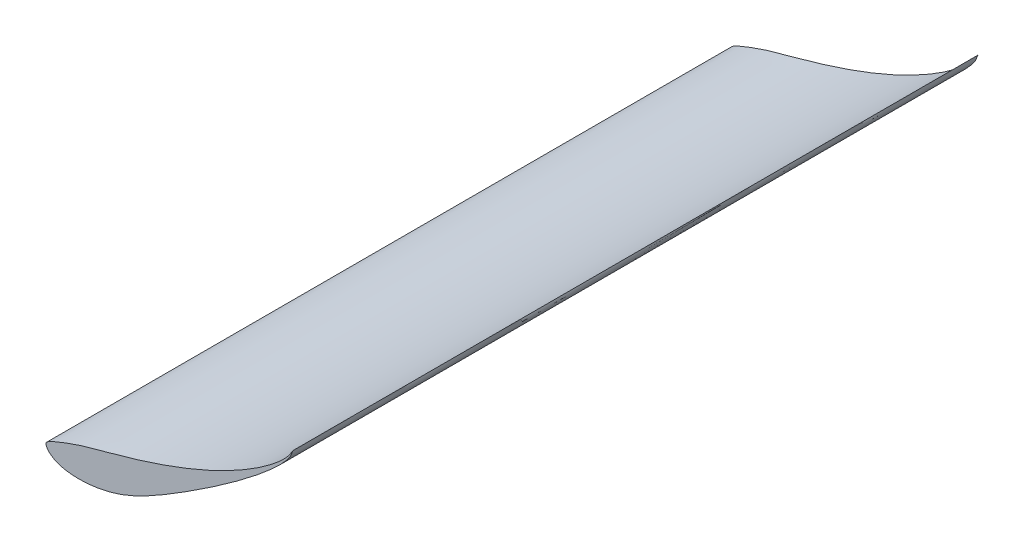
ISO-10303-21;
HEADER;
FILE_DESCRIPTION(('STEP AP214'),'2;1');
FILE_NAME('part.step','',(''),(''),'','','');
FILE_SCHEMA(('AUTOMOTIVE_DESIGN { 1 0 10303 214 1 1 1 1 }'));
ENDSEC;
DATA;
#1=APPLICATION_CONTEXT('core data for automotive mechanical design processes');
#2=APPLICATION_PROTOCOL_DEFINITION('international standard','automotive_design',2000,#1);
#3=PRODUCT_CONTEXT('',#1,'mechanical');
#4=PRODUCT('Part','Part','',(#3));
#5=PRODUCT_RELATED_PRODUCT_CATEGORY('part','',(#4));
#6=PRODUCT_DEFINITION_FORMATION('','',#4);
#7=PRODUCT_DEFINITION_CONTEXT('part definition',#1,'design');
#8=PRODUCT_DEFINITION('design','',#6,#7);
#9=PRODUCT_DEFINITION_SHAPE('','',#8);
#10=(LENGTH_UNIT() NAMED_UNIT(*) SI_UNIT(.MILLI.,.METRE.));
#11=(NAMED_UNIT(*) PLANE_ANGLE_UNIT() SI_UNIT($,.RADIAN.));
#12=(NAMED_UNIT(*) SI_UNIT($,.STERADIAN.) SOLID_ANGLE_UNIT());
#13=UNCERTAINTY_MEASURE_WITH_UNIT(LENGTH_MEASURE(1.E-05),#10,'distance_accuracy_value','');
#14=(GEOMETRIC_REPRESENTATION_CONTEXT(3) GLOBAL_UNCERTAINTY_ASSIGNED_CONTEXT((#13)) GLOBAL_UNIT_ASSIGNED_CONTEXT((#10,
#11,#12)) REPRESENTATION_CONTEXT('',''));
#15=CARTESIAN_POINT('',(0.,0.,0.));
#16=DIRECTION('',(0.,0.,1.));
#17=DIRECTION('',(1.,0.,0.));
#18=AXIS2_PLACEMENT_3D('',#15,#16,#17);
#19=CARTESIAN_POINT('',(161.78292833385,78.9068064220341,225.));
#20=CARTESIAN_POINT('',(161.779890528459,78.9105267032101,225.));
#21=CARTESIAN_POINT('',(161.361767914941,78.181322040841,225.));
#22=CARTESIAN_POINT('',(160.872984322097,77.4239718536298,225.));
#23=CARTESIAN_POINT('',(159.596742998734,75.4604825054433,225.));
#24=CARTESIAN_POINT('',(157.720496903785,73.0950450264297,225.));
#25=CARTESIAN_POINT('',(154.914276771153,70.1415204381813,225.));
#26=CARTESIAN_POINT('',(151.307423479854,66.8974160847578,225.));
#27=CARTESIAN_POINT('',(146.950282394384,63.3845742926751,225.));
#28=CARTESIAN_POINT('',(141.906063930267,59.7027741862972,225.));
#29=CARTESIAN_POINT('',(136.223432896034,55.9166630844412,225.));
#30=CARTESIAN_POINT('',(129.969981168829,52.088644910438,225.));
#31=CARTESIAN_POINT('',(123.212042913218,48.2809366699587,225.));
#32=CARTESIAN_POINT('',(116.03070441763,44.5396883417728,225.));
#33=CARTESIAN_POINT('',(108.507071587861,40.9100453595632,225.));
#34=CARTESIAN_POINT('',(100.725974603383,37.4306726469589,225.));
#35=CARTESIAN_POINT('',(92.777279952241,34.1281303923126,225.));
#36=CARTESIAN_POINT('',(84.7506190074985,31.0234144511162,225.));
#37=CARTESIAN_POINT('',(76.7316485418162,28.1372099946649,225.));
#38=CARTESIAN_POINT('',(68.810432320772,25.4674325084842,225.));
#39=CARTESIAN_POINT('',(61.0676685014536,23.0186846786382,225.));
#40=CARTESIAN_POINT('',(53.5847650426942,20.7819688270092,225.));
#41=CARTESIAN_POINT('',(46.4340457349053,18.7453778583554,225.));
#42=CARTESIAN_POINT('',(39.6852829855735,16.8884859248006,225.));
#43=CARTESIAN_POINT('',(33.4007785153507,15.1821298053462,225.));
#44=CARTESIAN_POINT('',(27.6221760284338,13.6122493136479,225.));
#45=CARTESIAN_POINT('',(22.3792349666251,12.0507487268589,225.));
#46=CARTESIAN_POINT('',(17.6603141897234,10.4615541187885,225.));
#47=CARTESIAN_POINT('',(13.4177767791754,8.9478404004681,225.));
#48=CARTESIAN_POINT('',(9.66654653539217,7.52880663894562,225.));
#49=CARTESIAN_POINT('',(6.44701805109813,6.21485419211678,225.));
#50=CARTESIAN_POINT('',(3.77915860551049,5.0531293587535,225.));
#51=CARTESIAN_POINT('',(1.73706036374504,3.9666714024391,225.));
#52=CARTESIAN_POINT('',(0.255014697455236,3.15049500516819,225.));
#53=CARTESIAN_POINT('',(-0.612510818545581,2.06211065328241,225.));
#54=CARTESIAN_POINT('',(-0.388381138025455,0.831268733081405,225.));
#55=CARTESIAN_POINT('',(0.135766851155978,-0.374288757361763,225.));
#56=CARTESIAN_POINT('',(1.08366074359763,-1.63964265183041,225.));
#57=CARTESIAN_POINT('',(2.3818775815346,-2.87826194582571,225.));
#58=CARTESIAN_POINT('',(4.03353861722545,-4.0441468062405,225.));
#59=CARTESIAN_POINT('',(6.01638103204055,-5.10348739841658,225.));
#60=CARTESIAN_POINT('',(8.35379285350588,-5.98236364560135,225.));
#61=CARTESIAN_POINT('',(11.0315489398007,-6.67022982496091,225.));
#62=CARTESIAN_POINT('',(14.0307852544234,-7.19805140512737,225.));
#63=CARTESIAN_POINT('',(17.3339631976692,-7.53218836319167,225.));
#64=CARTESIAN_POINT('',(20.914788835034,-7.65910589997498,225.));
#65=CARTESIAN_POINT('',(24.7494029994471,-7.56913669899957,225.));
#66=CARTESIAN_POINT('',(28.8135163870402,-7.23798229280122,225.));
#67=CARTESIAN_POINT('',(33.082431282419,-6.66884286338505,225.));
#68=CARTESIAN_POINT('',(37.5265875268402,-5.84075548538762,225.));
#69=CARTESIAN_POINT('',(42.1200669350474,-4.74263719445097,225.));
#70=CARTESIAN_POINT('',(46.8336557360594,-3.32539469082277,225.));
#71=CARTESIAN_POINT('',(51.669344781116,-1.59043528701546,225.));
#72=CARTESIAN_POINT('',(56.6230897618014,0.517955957713847,225.));
#73=CARTESIAN_POINT('',(61.7065220274405,2.98068239737995,225.));
#74=CARTESIAN_POINT('',(66.9567538070168,5.6976166039557,225.));
#75=CARTESIAN_POINT('',(72.3336969747133,8.68188758465662,225.));
#76=CARTESIAN_POINT('',(77.8229500615314,11.8850880933456,225.));
#77=CARTESIAN_POINT('',(83.4030473685376,15.2686408602552,225.));
#78=CARTESIAN_POINT('',(89.0475887751343,18.7824111048689,225.));
#79=CARTESIAN_POINT('',(94.7137570741183,22.3912773013876,225.));
#80=CARTESIAN_POINT('',(100.360291373089,26.0537862860099,225.));
#81=CARTESIAN_POINT('',(105.936655775352,29.751722799767,225.));
#82=CARTESIAN_POINT('',(111.400902448449,33.4614974533303,225.));
#83=CARTESIAN_POINT('',(116.718635970264,37.158055882973,225.));
#84=CARTESIAN_POINT('',(121.851807554897,40.8249941356383,225.));
#85=CARTESIAN_POINT('',(126.774094995133,44.4344939905141,225.));
#86=CARTESIAN_POINT('',(131.452183110523,47.9685796053568,225.));
#87=CARTESIAN_POINT('',(135.861918866711,51.4000588728441,225.));
#88=CARTESIAN_POINT('',(139.975887074324,54.7089766967872,225.));
#89=CARTESIAN_POINT('',(143.769714100562,57.8753104713641,225.));
#90=CARTESIAN_POINT('',(147.222429639158,60.879306118381,225.));
#91=CARTESIAN_POINT('',(150.316872974653,63.7004737337815,225.));
#92=CARTESIAN_POINT('',(153.035247672918,66.3239759565144,225.));
#93=CARTESIAN_POINT('',(155.365226619223,68.7325336492973,225.));
#94=CARTESIAN_POINT('',(157.297142206756,70.9124448027032,225.));
#95=CARTESIAN_POINT('',(158.834096281736,72.8479891169619,225.));
#96=CARTESIAN_POINT('',(159.963686697046,74.6226458357538,225.));
#97=CARTESIAN_POINT('',(160.663662421299,76.1779194277285,225.));
#98=CARTESIAN_POINT('',(161.212790738735,77.5868099958104,225.));
#99=CARTESIAN_POINT('',(161.447333120915,78.2475076260516,225.));
#100=CARTESIAN_POINT('',(161.785905611456,78.9031602668631,225.));
#101=CARTESIAN_POINT('',(161.78292833385,78.9068064220341,225.));
#102=B_SPLINE_CURVE_WITH_KNOTS('',3,(#19,#20,#21,#22,#23,#24,#25,#26,#27,#28,#29,#30,#31,#32,
#33,#34,#35,#36,#37,#38,#39,#40,#41,#42,#43,#44,#45,#46,#47,#48,#49,#50,#51,#52,#53,#54,#55,#56,
#57,#58,#59,#60,#61,#62,#63,#64,#65,#66,#67,#68,#69,#70,#71,#72,#73,#74,#75,#76,#77,#78,#79,#80,
#81,#82,#83,#84,#85,#86,#87,#88,#89,#90,#91,#92,#93,#94,#95,#96,#97,#98,#99,#100,#101),
.UNSPECIFIED.,.T.,.F.,(4,1,1,1,1,1,1,1,1,1,1,1,1,1,1,1,1,1,1,1,1,1,1,1,1,1,1,1,1,1,1,1,1,1,1,1,
1,1,1,1,1,1,1,1,1,1,1,1,1,1,1,1,1,1,1,1,1,1,1,1,1,1,1,1,1,1,1,1,1,1,1,1,1,1,1,1,1,1,1,1,4),(0.,
0.000999594313299212,0.00414743475003776,0.00974820897402406,0.0180443769200241,
0.0288641783652488,0.0418307896412055,0.056713806957678,0.0733412324180672,0.0915079886594423,
0.111021837040934,0.131661709492213,0.153207715119588,0.175433402170293,0.198110317315045,
0.221011446315139,0.243905882495844,0.266573311035611,0.288810349135398,0.310405035997316,
0.331177743204304,0.350943876391455,0.369556399670184,0.386864963345299,0.402753039208368,
0.417195875784384,0.430379518903367,0.44236263317429,0.453032155511854,0.462284345612073,
0.470026206002306,0.476176644820514,0.4806499474091,0.483553073373249,0.486420689318958,
0.489953231463337,0.49409692674396,0.498850588304448,0.504196750280793,0.510125492183598,
0.516691031253851,0.524011699263473,0.532092122465354,0.540897920896839,0.550403413935838,
0.560581040891741,0.571396483088815,0.582828080950064,0.594829641292505,0.607347037120814,
0.620384325080165,0.633968936607918,0.648199967415963,0.663193936825189,0.678898580785939,
0.695226562400326,0.712113220733955,0.729459406270428,0.747143116877991,0.765009771536014,
0.782904928287736,0.800688045055655,0.818242104849469,0.835449083117584,0.852211620697039,
0.868429578359411,0.884009362888173,0.898854951230209,0.912881826809319,0.926010749515415,
0.938166770937821,0.949289699209522,0.959322171916738,0.968216949447241,0.975948220006129,
0.982474409223121,0.987904722814407,0.992516501480522,0.996351137832237,0.999020322442866,1.),.UNSPECIFIED.);
#103=DIRECTION('',(0.,0.,-1.));
#104=VECTOR('',#103,1.);
#105=SURFACE_OF_LINEAR_EXTRUSION('',#102,#104);
#106=CARTESIAN_POINT('',(161.78292833385,78.9068064220341,225.));
#107=VERTEX_POINT('',#106);
#108=EDGE_CURVE('E10',#107,#107,#102,.T.);
#109=ORIENTED_EDGE('',*,*,#108,.F.);
#110=EDGE_LOOP('',(#109));
#111=FACE_BOUND('',#110,.T.);
#112=CARTESIAN_POINT('',(161.78292833385,78.9068064220341,-225.));
#113=CARTESIAN_POINT('',(161.779890528459,78.9105267032101,-225.));
#114=CARTESIAN_POINT('',(161.361767914941,78.181322040841,-225.));
#115=CARTESIAN_POINT('',(160.872984322097,77.4239718536298,-225.));
#116=CARTESIAN_POINT('',(159.596742998734,75.4604825054433,-225.));
#117=CARTESIAN_POINT('',(157.720496903785,73.0950450264297,-225.));
#118=CARTESIAN_POINT('',(154.914276771153,70.1415204381813,-225.));
#119=CARTESIAN_POINT('',(151.307423479854,66.8974160847578,-225.));
#120=CARTESIAN_POINT('',(146.950282394384,63.3845742926751,-225.));
#121=CARTESIAN_POINT('',(141.906063930267,59.7027741862972,-225.));
#122=CARTESIAN_POINT('',(136.223432896034,55.9166630844412,-225.));
#123=CARTESIAN_POINT('',(129.969981168829,52.088644910438,-225.));
#124=CARTESIAN_POINT('',(123.212042913218,48.2809366699587,-225.));
#125=CARTESIAN_POINT('',(116.03070441763,44.5396883417728,-225.));
#126=CARTESIAN_POINT('',(108.507071587861,40.9100453595632,-225.));
#127=CARTESIAN_POINT('',(100.725974603383,37.4306726469589,-225.));
#128=CARTESIAN_POINT('',(92.777279952241,34.1281303923126,-225.));
#129=CARTESIAN_POINT('',(84.7506190074985,31.0234144511162,-225.));
#130=CARTESIAN_POINT('',(76.7316485418162,28.1372099946649,-225.));
#131=CARTESIAN_POINT('',(68.810432320772,25.4674325084842,-225.));
#132=CARTESIAN_POINT('',(61.0676685014536,23.0186846786382,-225.));
#133=CARTESIAN_POINT('',(53.5847650426942,20.7819688270092,-225.));
#134=CARTESIAN_POINT('',(46.4340457349053,18.7453778583554,-225.));
#135=CARTESIAN_POINT('',(39.6852829855735,16.8884859248006,-225.));
#136=CARTESIAN_POINT('',(33.4007785153507,15.1821298053462,-225.));
#137=CARTESIAN_POINT('',(27.6221760284338,13.6122493136479,-225.));
#138=CARTESIAN_POINT('',(22.3792349666251,12.0507487268589,-225.));
#139=CARTESIAN_POINT('',(17.6603141897234,10.4615541187885,-225.));
#140=CARTESIAN_POINT('',(13.4177767791754,8.9478404004681,-225.));
#141=CARTESIAN_POINT('',(9.66654653539217,7.52880663894562,-225.));
#142=CARTESIAN_POINT('',(6.44701805109813,6.21485419211678,-225.));
#143=CARTESIAN_POINT('',(3.77915860551049,5.0531293587535,-225.));
#144=CARTESIAN_POINT('',(1.73706036374504,3.9666714024391,-225.));
#145=CARTESIAN_POINT('',(0.255014697455236,3.15049500516819,-225.));
#146=CARTESIAN_POINT('',(-0.612510818545581,2.06211065328241,-225.));
#147=CARTESIAN_POINT('',(-0.388381138025455,0.831268733081405,-225.));
#148=CARTESIAN_POINT('',(0.135766851155978,-0.374288757361763,-225.));
#149=CARTESIAN_POINT('',(1.08366074359763,-1.63964265183041,-225.));
#150=CARTESIAN_POINT('',(2.3818775815346,-2.87826194582571,-225.));
#151=CARTESIAN_POINT('',(4.03353861722545,-4.0441468062405,-225.));
#152=CARTESIAN_POINT('',(6.01638103204055,-5.10348739841658,-225.));
#153=CARTESIAN_POINT('',(8.35379285350588,-5.98236364560135,-225.));
#154=CARTESIAN_POINT('',(11.0315489398007,-6.67022982496091,-225.));
#155=CARTESIAN_POINT('',(14.0307852544234,-7.19805140512737,-225.));
#156=CARTESIAN_POINT('',(17.3339631976692,-7.53218836319167,-225.));
#157=CARTESIAN_POINT('',(20.914788835034,-7.65910589997498,-225.));
#158=CARTESIAN_POINT('',(24.7494029994471,-7.56913669899957,-225.));
#159=CARTESIAN_POINT('',(28.8135163870402,-7.23798229280122,-225.));
#160=CARTESIAN_POINT('',(33.082431282419,-6.66884286338505,-225.));
#161=CARTESIAN_POINT('',(37.5265875268402,-5.84075548538762,-225.));
#162=CARTESIAN_POINT('',(42.1200669350474,-4.74263719445097,-225.));
#163=CARTESIAN_POINT('',(46.8336557360594,-3.32539469082277,-225.));
#164=CARTESIAN_POINT('',(51.669344781116,-1.59043528701546,-225.));
#165=CARTESIAN_POINT('',(56.6230897618014,0.517955957713847,-225.));
#166=CARTESIAN_POINT('',(61.7065220274405,2.98068239737995,-225.));
#167=CARTESIAN_POINT('',(66.9567538070168,5.6976166039557,-225.));
#168=CARTESIAN_POINT('',(72.3336969747133,8.68188758465662,-225.));
#169=CARTESIAN_POINT('',(77.8229500615314,11.8850880933456,-225.));
#170=CARTESIAN_POINT('',(83.4030473685376,15.2686408602552,-225.));
#171=CARTESIAN_POINT('',(89.0475887751343,18.7824111048689,-225.));
#172=CARTESIAN_POINT('',(94.7137570741183,22.3912773013876,-225.));
#173=CARTESIAN_POINT('',(100.360291373089,26.0537862860099,-225.));
#174=CARTESIAN_POINT('',(105.936655775352,29.751722799767,-225.));
#175=CARTESIAN_POINT('',(111.400902448449,33.4614974533303,-225.));
#176=CARTESIAN_POINT('',(116.718635970264,37.158055882973,-225.));
#177=CARTESIAN_POINT('',(121.851807554897,40.8249941356383,-225.));
#178=CARTESIAN_POINT('',(126.774094995133,44.4344939905141,-225.));
#179=CARTESIAN_POINT('',(131.452183110523,47.9685796053568,-225.));
#180=CARTESIAN_POINT('',(135.861918866711,51.4000588728441,-225.));
#181=CARTESIAN_POINT('',(139.975887074324,54.7089766967872,-225.));
#182=CARTESIAN_POINT('',(143.769714100562,57.8753104713641,-225.));
#183=CARTESIAN_POINT('',(147.222429639158,60.879306118381,-225.));
#184=CARTESIAN_POINT('',(150.316872974653,63.7004737337815,-225.));
#185=CARTESIAN_POINT('',(153.035247672918,66.3239759565144,-225.));
#186=CARTESIAN_POINT('',(155.365226619223,68.7325336492973,-225.));
#187=CARTESIAN_POINT('',(157.297142206756,70.9124448027032,-225.));
#188=CARTESIAN_POINT('',(158.834096281736,72.8479891169619,-225.));
#189=CARTESIAN_POINT('',(159.963686697046,74.6226458357538,-225.));
#190=CARTESIAN_POINT('',(160.663662421299,76.1779194277285,-225.));
#191=CARTESIAN_POINT('',(161.212790738735,77.5868099958104,-225.));
#192=CARTESIAN_POINT('',(161.447333120915,78.2475076260516,-225.));
#193=CARTESIAN_POINT('',(161.785905611456,78.9031602668631,-225.));
#194=CARTESIAN_POINT('',(161.78292833385,78.9068064220341,-225.));
#195=B_SPLINE_CURVE_WITH_KNOTS('',3,(#112,#113,#114,#115,#116,#117,#118,#119,#120,#121,#122,
#123,#124,#125,#126,#127,#128,#129,#130,#131,#132,#133,#134,#135,#136,#137,#138,#139,#140,#141,
#142,#143,#144,#145,#146,#147,#148,#149,#150,#151,#152,#153,#154,#155,#156,#157,#158,#159,#160,
#161,#162,#163,#164,#165,#166,#167,#168,#169,#170,#171,#172,#173,#174,#175,#176,#177,#178,#179,
#180,#181,#182,#183,#184,#185,#186,#187,#188,#189,#190,#191,#192,#193,#194),.UNSPECIFIED.,.T.,
.F.,(4,1,1,1,1,1,1,1,1,1,1,1,1,1,1,1,1,1,1,1,1,1,1,1,1,1,1,1,1,1,1,1,1,1,1,1,1,1,1,1,1,1,1,1,1,
1,1,1,1,1,1,1,1,1,1,1,1,1,1,1,1,1,1,1,1,1,1,1,1,1,1,1,1,1,1,1,1,1,1,1,4),(0.,
0.000999594313299212,0.00414743475003776,0.00974820897402406,0.0180443769200241,
0.0288641783652488,0.0418307896412055,0.056713806957678,0.0733412324180672,0.0915079886594423,
0.111021837040934,0.131661709492213,0.153207715119588,0.175433402170293,0.198110317315045,
0.221011446315139,0.243905882495844,0.266573311035611,0.288810349135398,0.310405035997316,
0.331177743204304,0.350943876391455,0.369556399670184,0.386864963345299,0.402753039208368,
0.417195875784384,0.430379518903367,0.44236263317429,0.453032155511854,0.462284345612073,
0.470026206002306,0.476176644820514,0.4806499474091,0.483553073373249,0.486420689318958,
0.489953231463337,0.49409692674396,0.498850588304448,0.504196750280793,0.510125492183598,
0.516691031253851,0.524011699263473,0.532092122465354,0.540897920896839,0.550403413935838,
0.560581040891741,0.571396483088815,0.582828080950064,0.594829641292505,0.607347037120814,
0.620384325080165,0.633968936607918,0.648199967415963,0.663193936825189,0.678898580785939,
0.695226562400326,0.712113220733955,0.729459406270428,0.747143116877991,0.765009771536014,
0.782904928287736,0.800688045055655,0.818242104849469,0.835449083117584,0.852211620697039,
0.868429578359411,0.884009362888173,0.898854951230209,0.912881826809319,0.926010749515415,
0.938166770937821,0.949289699209522,0.959322171916738,0.968216949447241,0.975948220006129,
0.982474409223121,0.987904722814407,0.992516501480522,0.996351137832237,0.999020322442866,1.),.UNSPECIFIED.);
#196=CARTESIAN_POINT('',(161.78292833385,78.9068064220341,-225.));
#197=VERTEX_POINT('',#196);
#198=EDGE_CURVE('E40',#197,#197,#195,.T.);
#199=ORIENTED_EDGE('',*,*,#198,.T.);
#200=EDGE_LOOP('',(#199));
#201=FACE_BOUND('',#200,.T.);
#202=ADVANCED_FACE('F31',(#111,#201),#105,.F.);
#203=CARTESIAN_POINT('',(2.69264130624221,-3.06617627134765,225.));
#204=DIRECTION('',(0.,0.,1.));
#205=DIRECTION('',(1.,0.,0.));
#206=AXIS2_PLACEMENT_3D('',#203,#204,#205);
#207=PLANE('',#206);
#208=ORIENTED_EDGE('',*,*,#108,.T.);
#209=EDGE_LOOP('',(#208));
#210=FACE_BOUND('',#209,.T.);
#211=ADVANCED_FACE('F57',(#210),#207,.T.);
#212=CARTESIAN_POINT('',(2.69264130624221,-3.06617627134765,-225.));
#213=DIRECTION('',(0.,0.,1.));
#214=DIRECTION('',(1.,0.,0.));
#215=AXIS2_PLACEMENT_3D('',#212,#213,#214);
#216=PLANE('',#215);
#217=ORIENTED_EDGE('',*,*,#198,.F.);
#218=EDGE_LOOP('',(#217));
#219=FACE_BOUND('',#218,.T.);
#220=ADVANCED_FACE('F53',(#219),#216,.F.);
#221=CLOSED_SHELL('',(#202,#211,#220));
#222=MANIFOLD_SOLID_BREP('B2',#221);
#223=ADVANCED_BREP_SHAPE_REPRESENTATION('',(#18,#222),#14);
#224=SHAPE_DEFINITION_REPRESENTATION(#9,#223);
ENDSEC;
END-ISO-10303-21;
